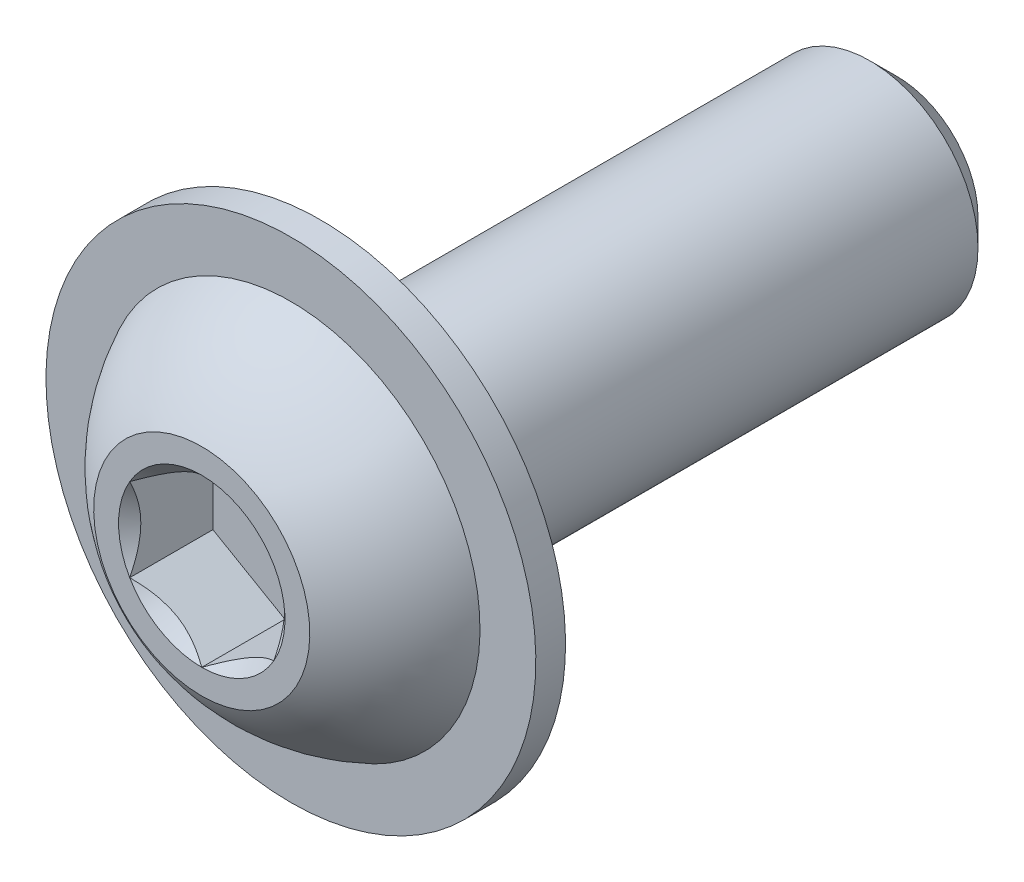
ISO-10303-21;
HEADER;
FILE_DESCRIPTION(('STEP AP214'),'2;1');
FILE_NAME('part.step','',(''),(''),'','','');
FILE_SCHEMA(('AUTOMOTIVE_DESIGN { 1 0 10303 214 1 1 1 1 }'));
ENDSEC;
DATA;
#1=APPLICATION_CONTEXT('core data for automotive mechanical design processes');
#2=APPLICATION_PROTOCOL_DEFINITION('international standard','automotive_design',2000,#1);
#3=PRODUCT_CONTEXT('',#1,'mechanical');
#4=PRODUCT('Part','Part','',(#3));
#5=PRODUCT_RELATED_PRODUCT_CATEGORY('part','',(#4));
#6=PRODUCT_DEFINITION_FORMATION('','',#4);
#7=PRODUCT_DEFINITION_CONTEXT('part definition',#1,'design');
#8=PRODUCT_DEFINITION('design','',#6,#7);
#9=PRODUCT_DEFINITION_SHAPE('','',#8);
#10=(LENGTH_UNIT() NAMED_UNIT(*) SI_UNIT(.MILLI.,.METRE.));
#11=(NAMED_UNIT(*) PLANE_ANGLE_UNIT() SI_UNIT($,.RADIAN.));
#12=(NAMED_UNIT(*) SI_UNIT($,.STERADIAN.) SOLID_ANGLE_UNIT());
#13=UNCERTAINTY_MEASURE_WITH_UNIT(LENGTH_MEASURE(1.E-05),#10,'distance_accuracy_value','');
#14=(GEOMETRIC_REPRESENTATION_CONTEXT(3) GLOBAL_UNCERTAINTY_ASSIGNED_CONTEXT((#13)) GLOBAL_UNIT_ASSIGNED_CONTEXT((#10,
#11,#12)) REPRESENTATION_CONTEXT('',''));
#15=CARTESIAN_POINT('',(0.,0.,0.));
#16=DIRECTION('',(0.,0.,1.));
#17=DIRECTION('',(1.,0.,0.));
#18=AXIS2_PLACEMENT_3D('',#15,#16,#17);
#19=CARTESIAN_POINT('',(0.,3.,-9.65));
#20=DIRECTION('',(0.,0.,1.));
#21=DIRECTION('',(1.,0.,0.));
#22=AXIS2_PLACEMENT_3D('',#19,#20,#21);
#23=PLANE('',#22);
#24=CARTESIAN_POINT('',(0.,0.,-9.65));
#25=DIRECTION('',(0.,0.,1.));
#26=DIRECTION('',(1.,0.,0.));
#27=AXIS2_PLACEMENT_3D('',#24,#25,#26);
#28=CIRCLE('',#27,2.25);
#29=CARTESIAN_POINT('',(2.25,0.,-9.65));
#30=VERTEX_POINT('',#29);
#31=EDGE_CURVE('E57',#30,#30,#28,.F.);
#32=ORIENTED_EDGE('',*,*,#31,.T.);
#33=EDGE_LOOP('',(#32));
#34=FACE_BOUND('',#33,.T.);
#35=ADVANCED_FACE('F42',(#34),#23,.F.);
#36=CARTESIAN_POINT('',(0.,0.,9.65));
#37=DIRECTION('',(0.,0.,1.));
#38=DIRECTION('',(1.,0.,0.));
#39=AXIS2_PLACEMENT_3D('',#36,#37,#38);
#40=CYLINDRICAL_SURFACE('',#39,3.);
#41=CARTESIAN_POINT('',(0.,0.,-8.90000000000001));
#42=DIRECTION('',(0.,0.,1.));
#43=DIRECTION('',(1.,0.,0.));
#44=AXIS2_PLACEMENT_3D('',#41,#42,#43);
#45=CIRCLE('',#44,3.);
#46=CARTESIAN_POINT('',(3.,0.,-8.90000000000001));
#47=VERTEX_POINT('',#46);
#48=EDGE_CURVE('E211',#47,#47,#45,.T.);
#49=ORIENTED_EDGE('',*,*,#48,.T.);
#50=EDGE_LOOP('',(#49));
#51=FACE_BOUND('',#50,.T.);
#52=CARTESIAN_POINT('',(0.,0.,6.35));
#53=DIRECTION('',(0.,0.,1.));
#54=DIRECTION('',(1.,0.,0.));
#55=AXIS2_PLACEMENT_3D('',#52,#53,#54);
#56=CIRCLE('',#55,3.);
#57=CARTESIAN_POINT('',(3.,0.,6.35));
#58=VERTEX_POINT('',#57);
#59=EDGE_CURVE('E207',#58,#58,#56,.T.);
#60=ORIENTED_EDGE('',*,*,#59,.F.);
#61=EDGE_LOOP('',(#60));
#62=FACE_BOUND('',#61,.T.);
#63=ADVANCED_FACE('F222',(#51,#62),#40,.T.);
#64=CARTESIAN_POINT('',(0.,0.,-8.90000000000001));
#65=DIRECTION('',(0.,0.,1.));
#66=DIRECTION('',(1.,0.,0.));
#67=AXIS2_PLACEMENT_3D('',#64,#65,#66);
#68=CONICAL_SURFACE('',#67,3.,0.785398163397451);
#69=CARTESIAN_POINT('',(2.25,0.,-9.65));
#70=CARTESIAN_POINT('',(2.2578125,0.,-9.6421875));
#71=CARTESIAN_POINT('',(2.265625,0.,-9.634375));
#72=CARTESIAN_POINT('',(2.28125,0.,-9.61875));
#73=CARTESIAN_POINT('',(2.2890625,0.,-9.6109375));
#74=CARTESIAN_POINT('',(2.3046875,0.,-9.5953125));
#75=CARTESIAN_POINT('',(2.3125,0.,-9.5875));
#76=CARTESIAN_POINT('',(2.328125,0.,-9.571875));
#77=CARTESIAN_POINT('',(2.3359375,0.,-9.5640625));
#78=CARTESIAN_POINT('',(2.3515625,0.,-9.5484375));
#79=CARTESIAN_POINT('',(2.359375,0.,-9.540625));
#80=CARTESIAN_POINT('',(2.375,0.,-9.525));
#81=CARTESIAN_POINT('',(2.3828125,0.,-9.5171875));
#82=CARTESIAN_POINT('',(2.3984375,0.,-9.5015625));
#83=CARTESIAN_POINT('',(2.40625,0.,-9.49375));
#84=CARTESIAN_POINT('',(2.421875,0.,-9.478125));
#85=CARTESIAN_POINT('',(2.4296875,0.,-9.4703125));
#86=CARTESIAN_POINT('',(2.4453125,0.,-9.4546875));
#87=CARTESIAN_POINT('',(2.453125,0.,-9.446875));
#88=CARTESIAN_POINT('',(2.46875,0.,-9.43125));
#89=CARTESIAN_POINT('',(2.4765625,0.,-9.4234375));
#90=CARTESIAN_POINT('',(2.4921875,0.,-9.4078125));
#91=CARTESIAN_POINT('',(2.5,0.,-9.4));
#92=CARTESIAN_POINT('',(2.515625,0.,-9.384375));
#93=CARTESIAN_POINT('',(2.5234375,0.,-9.3765625));
#94=CARTESIAN_POINT('',(2.5390625,0.,-9.3609375));
#95=CARTESIAN_POINT('',(2.546875,0.,-9.353125));
#96=CARTESIAN_POINT('',(2.5625,0.,-9.3375));
#97=CARTESIAN_POINT('',(2.5703125,0.,-9.3296875));
#98=CARTESIAN_POINT('',(2.5859375,0.,-9.3140625));
#99=CARTESIAN_POINT('',(2.59375,0.,-9.30625));
#100=CARTESIAN_POINT('',(2.609375,0.,-9.290625));
#101=CARTESIAN_POINT('',(2.6171875,0.,-9.2828125));
#102=CARTESIAN_POINT('',(2.6328125,0.,-9.2671875));
#103=CARTESIAN_POINT('',(2.640625,0.,-9.259375));
#104=CARTESIAN_POINT('',(2.65625,0.,-9.24375));
#105=CARTESIAN_POINT('',(2.6640625,0.,-9.2359375));
#106=CARTESIAN_POINT('',(2.6796875,0.,-9.2203125));
#107=CARTESIAN_POINT('',(2.6875,0.,-9.2125));
#108=CARTESIAN_POINT('',(2.703125,0.,-9.196875));
#109=CARTESIAN_POINT('',(2.7109375,0.,-9.1890625));
#110=CARTESIAN_POINT('',(2.7265625,0.,-9.1734375));
#111=CARTESIAN_POINT('',(2.734375,0.,-9.165625));
#112=CARTESIAN_POINT('',(2.75,0.,-9.15));
#113=CARTESIAN_POINT('',(2.7578125,0.,-9.1421875));
#114=CARTESIAN_POINT('',(2.7734375,0.,-9.1265625));
#115=CARTESIAN_POINT('',(2.78125,0.,-9.11875));
#116=CARTESIAN_POINT('',(2.796875,0.,-9.103125));
#117=CARTESIAN_POINT('',(2.8046875,0.,-9.0953125));
#118=CARTESIAN_POINT('',(2.8203125,0.,-9.0796875));
#119=CARTESIAN_POINT('',(2.828125,0.,-9.071875));
#120=CARTESIAN_POINT('',(2.84375,0.,-9.05625000000001));
#121=CARTESIAN_POINT('',(2.8515625,0.,-9.0484375));
#122=CARTESIAN_POINT('',(2.8671875,0.,-9.0328125));
#123=CARTESIAN_POINT('',(2.875,0.,-9.02500000000001));
#124=CARTESIAN_POINT('',(2.890625,0.,-9.00937500000001));
#125=CARTESIAN_POINT('',(2.8984375,0.,-9.0015625));
#126=CARTESIAN_POINT('',(2.9140625,0.,-8.98593750000001));
#127=CARTESIAN_POINT('',(2.921875,0.,-8.97812500000001));
#128=CARTESIAN_POINT('',(2.9375,0.,-8.96250000000001));
#129=CARTESIAN_POINT('',(2.9453125,0.,-8.95468750000001));
#130=CARTESIAN_POINT('',(2.9609375,0.,-8.93906250000001));
#131=CARTESIAN_POINT('',(2.96875,0.,-8.93125000000001));
#132=CARTESIAN_POINT('',(2.984375,0.,-8.91562500000001));
#133=CARTESIAN_POINT('',(2.9921875,0.,-8.90781250000001));
#134=CARTESIAN_POINT('',(3.,0.,-8.90000000000001));
#135=B_SPLINE_CURVE_WITH_KNOTS('',3,(#69,#70,#71,#72,#73,#74,#75,#76,#77,#78,#79,#80,#81,#82,
#83,#84,#85,#86,#87,#88,#89,#90,#91,#92,#93,#94,#95,#96,#97,#98,#99,#100,#101,#102,#103,#104,
#105,#106,#107,#108,#109,#110,#111,#112,#113,#114,#115,#116,#117,#118,#119,#120,#121,#122,#123,
#124,#125,#126,#127,#128,#129,#130,#131,#132,#133,#134),.UNSPECIFIED.,.F.,.F.,(4,2,2,2,2,2,2,2,
2,2,2,2,2,2,2,2,2,2,2,2,2,2,2,2,2,2,2,2,2,2,2,2,4),(0.,0.0331456303681201,0.0662912607362389,
0.099436891104359,0.132582521472478,0.165728151840596,0.198873782208716,0.232019412576835,
0.265165042944954,0.298310673313074,0.331456303681193,0.364601934049313,0.397747564417432,
0.430893194785551,0.464038825153671,0.497184455521789,0.530330085889908,0.563475716258028,
0.596621346626147,0.629766976994267,0.662912607362386,0.696058237730504,0.729203868098624,
0.762349498466743,0.795495128834863,0.828640759202982,0.861786389571101,0.894932019939221,
0.92807765030734,0.961223280675459,0.994368911043578,1.0275145414117,1.06066017177982),.UNSPECIFIED.);
#136=EDGE_CURVE('BSEAM44',#30,#47,#135,.T.);
#137=ORIENTED_EDGE('',*,*,#31,.F.);
#138=ORIENTED_EDGE('',*,*,#48,.F.);
#139=ORIENTED_EDGE('',*,*,#136,.T.);
#140=ORIENTED_EDGE('',*,*,#136,.F.);
#141=EDGE_LOOP('',(#137,#139,#138,#140));
#142=FACE_BOUND('',#141,.T.);
#143=ADVANCED_FACE('F44',(#142),#68,.T.);
#144=CARTESIAN_POINT('',(0.,-6.8,6.35));
#145=DIRECTION('',(0.,0.,1.));
#146=DIRECTION('',(0.,-1.,0.));
#147=AXIS2_PLACEMENT_3D('',#144,#145,#146);
#148=PLANE('',#147);
#149=CARTESIAN_POINT('',(0.,0.,6.35));
#150=DIRECTION('',(0.,0.,1.));
#151=DIRECTION('',(0.,-1.,0.));
#152=AXIS2_PLACEMENT_3D('',#149,#150,#151);
#153=CIRCLE('',#152,6.8);
#154=CARTESIAN_POINT('',(0.,-6.8,6.35));
#155=VERTEX_POINT('',#154);
#156=EDGE_CURVE('E199',#155,#155,#153,.T.);
#157=ORIENTED_EDGE('',*,*,#156,.F.);
#158=EDGE_LOOP('',(#157));
#159=FACE_BOUND('',#158,.T.);
#160=ORIENTED_EDGE('',*,*,#59,.T.);
#161=EDGE_LOOP('',(#160));
#162=FACE_BOUND('',#161,.T.);
#163=ADVANCED_FACE('F221',(#159,#162),#148,.F.);
#164=CARTESIAN_POINT('',(0.,0.,4.6625));
#165=DIRECTION('',(0.,0.,1.));
#166=DIRECTION('',(0.,-1.,0.));
#167=AXIS2_PLACEMENT_3D('',#164,#165,#166);
#168=SPHERICAL_SURFACE('',#167,5.82023678642029);
#169=CARTESIAN_POINT('',(0.,0.,9.65));
#170=DIRECTION('',(0.,0.,1.));
#171=DIRECTION('',(0.,-1.,0.));
#172=AXIS2_PLACEMENT_3D('',#169,#170,#171);
#173=CIRCLE('',#172,3.);
#174=CARTESIAN_POINT('',(0.,-3.,9.65));
#175=VERTEX_POINT('',#174);
#176=EDGE_CURVE('E203',#175,#175,#173,.T.);
#177=CARTESIAN_POINT('',(0.,0.,7.175));
#178=DIRECTION('',(0.,0.,1.));
#179=DIRECTION('',(0.,-1.,0.));
#180=AXIS2_PLACEMENT_3D('',#177,#178,#179);
#181=CIRCLE('',#180,5.25);
#182=CARTESIAN_POINT('',(0.,-5.25,7.175));
#183=VERTEX_POINT('',#182);
#184=EDGE_CURVE('E191',#183,#183,#181,.T.);
#185=CARTESIAN_POINT('',(0.,-3.,9.65));
#186=CARTESIAN_POINT('',(0.,-3.03028420289884,9.63178398285952));
#187=CARTESIAN_POINT('',(0.,-3.0604024537021,9.6132920727079));
#188=CARTESIAN_POINT('',(0.,-3.12029714687073,9.57576274503713));
#189=CARTESIAN_POINT('',(0.,-3.1500735892361,9.556725327518));
#190=CARTESIAN_POINT('',(0.,-3.20927476128223,9.518111263767));
#191=CARTESIAN_POINT('',(0.,-3.23869949096298,9.49853461753513));
#192=CARTESIAN_POINT('',(0.,-3.29718748048685,9.45884860243864));
#193=CARTESIAN_POINT('',(0.,-3.32625074032996,9.43873923357403));
#194=CARTESIAN_POINT('',(0.,-3.38400614482375,9.39799444306176));
#195=CARTESIAN_POINT('',(0.,-3.41269828947443,9.3773590214141));
#196=CARTESIAN_POINT('',(0.,-3.46970194355215,9.33556897322005));
#197=CARTESIAN_POINT('',(0.,-3.4980134529792,9.31441434667365));
#198=CARTESIAN_POINT('',(0.,-3.55424644229442,9.27159290791346));
#199=CARTESIAN_POINT('',(0.,-3.5821679221826,9.24992609569967));
#200=CARTESIAN_POINT('',(0.,-3.63761158767924,9.2060874750371));
#201=CARTESIAN_POINT('',(0.,-3.66513377328771,9.18391566658832));
#202=CARTESIAN_POINT('',(0.,-3.7197697179341,9.13907441038664));
#203=CARTESIAN_POINT('',(0.,-3.74688347697201,9.11640496263375));
#204=CARTESIAN_POINT('',(0.,-3.80069357171985,9.07057594989702));
#205=CARTESIAN_POINT('',(0.,-3.82738990742978,9.04741638491319));
#206=CARTESIAN_POINT('',(0.,-3.88035629726865,9.00061482241131));
#207=CARTESIAN_POINT('',(0.,-3.90662635139759,8.97697282489327));
#208=CARTESIAN_POINT('',(0.,-3.95873146126904,8.92921424209951));
#209=CARTESIAN_POINT('',(0.,-3.98456651701155,8.90509765682379));
#210=CARTESIAN_POINT('',(0.,-4.03579305764359,8.85639790076632));
#211=CARTESIAN_POINT('',(0.,-4.06118454253313,8.83181472998457));
#212=CARTESIAN_POINT('',(0.,-4.11151551617632,8.782189959987));
#213=CARTESIAN_POINT('',(0.,-4.13645500492997,8.75714836077117));
#214=CARTESIAN_POINT('',(0.,-4.18587371099773,8.70661504309093));
#215=CARTESIAN_POINT('',(0.,-4.21035292831183,8.68112332462652));
#216=CARTESIAN_POINT('',(0.,-4.25884296892189,8.62969822699104));
#217=CARTESIAN_POINT('',(0.,-4.28285379221785,8.60376484781998));
#218=CARTESIAN_POINT('',(0.,-4.33039907763335,8.55146503386293));
#219=CARTESIAN_POINT('',(0.,-4.35393353975289,8.52509859907694));
#220=CARTESIAN_POINT('',(0.,-4.40051829372119,8.47194142267622));
#221=CARTESIAN_POINT('',(0.,-4.42356858556995,8.4451506810615));
#222=CARTESIAN_POINT('',(0.,-4.46917735055741,8.39115378058099));
#223=CARTESIAN_POINT('',(0.,-4.49173582369612,8.36394762171521));
#224=CARTESIAN_POINT('',(0.,-4.5363534660172,8.30912891415208));
#225=CARTESIAN_POINT('',(0.,-4.55841263519958,8.28151636545474));
#226=CARTESIAN_POINT('',(0.,-4.60202435003835,8.2258940404943));
#227=CARTESIAN_POINT('',(0.,-4.62357689569476,8.19788426423121));
#228=CARTESIAN_POINT('',(0.,-4.66616821201751,8.14147677821136));
#229=CARTESIAN_POINT('',(0.,-4.68720698268385,8.11307906845459));
#230=CARTESIAN_POINT('',(0.,-4.72876376804039,8.05590513824151));
#231=CARTESIAN_POINT('',(0.,-4.7492817827306,8.0271289177852));
#232=CARTESIAN_POINT('',(0.,-4.78979024794497,7.9692075145635));
#233=CARTESIAN_POINT('',(0.,-4.80978069846913,7.94006233179811));
#234=CARTESIAN_POINT('',(0.,-4.84922740221028,7.88141267477349));
#235=CARTESIAN_POINT('',(0.,-4.86868365542727,7.85190820051427));
#236=CARTESIAN_POINT('',(0.,-4.90705550868671,7.79254975054515));
#237=CARTESIAN_POINT('',(0.,-4.92597110872916,7.76269577483525));
#238=CARTESIAN_POINT('',(0.,-4.96325537909849,7.70264822794243));
#239=CARTESIAN_POINT('',(0.,-4.98162404942537,7.67245465675951));
#240=CARTESIAN_POINT('',(0.,-5.01780836556591,7.61173793771347));
#241=CARTESIAN_POINT('',(0.,-5.03562401137957,7.58121478985035));
#242=CARTESIAN_POINT('',(0.,-5.07069636621364,7.51984904510197));
#243=CARTESIAN_POINT('',(0.,-5.08795307523405,7.48900644821672));
#244=CARTESIAN_POINT('',(0.,-5.12190183333915,7.42701204092135));
#245=CARTESIAN_POINT('',(0.,-5.13859388242383,7.39586023051123));
#246=CARTESIAN_POINT('',(0.,-5.17140777116705,7.33325772739395));
#247=CARTESIAN_POINT('',(0.,-5.18752961082559,7.30180703468679));
#248=CARTESIAN_POINT('',(0.,-5.21919777159946,7.23861722302079));
#249=CARTESIAN_POINT('',(0.,-5.2347440927148,7.20687810406196));
#250=CARTESIAN_POINT('',(0.,-5.25,7.175));
#251=B_SPLINE_CURVE_WITH_KNOTS('',3,(#185,#186,#187,#188,#189,#190,#191,#192,#193,#194,#195,
#196,#197,#198,#199,#200,#201,#202,#203,#204,#205,#206,#207,#208,#209,#210,#211,#212,#213,#214,
#215,#216,#217,#218,#219,#220,#221,#222,#223,#224,#225,#226,#227,#228,#229,#230,#231,#232,#233,
#234,#235,#236,#237,#238,#239,#240,#241,#242,#243,#244,#245,#246,#247,#248,#249,#250),
.UNSPECIFIED.,.F.,.F.,(4,2,2,2,2,2,2,2,2,2,2,2,2,2,2,2,2,2,2,2,2,2,2,2,2,2,2,2,2,2,2,2,4),(0.,
0.106020256452207,0.212040512904415,0.318060769356622,0.424081025808829,0.530101282261036,
0.636121538713244,0.742141795165449,0.848162051617657,0.954182308069865,1.06020256452207,
1.16622282097428,1.27224307742649,1.37826333387869,1.4842835903309,1.59030384678311,
1.69632410323532,1.80234435968752,1.90836461613973,2.01438487259194,2.12040512904414,
2.22642538549635,2.33244564194856,2.43846589840076,2.54448615485297,2.65050641130518,
2.75652666775739,2.86254692420959,2.9685671806618,3.07458743711401,3.18060769356621,
3.28662795001842,3.39264820647063),.UNSPECIFIED.);
#252=EDGE_CURVE('BSEAM231',#175,#183,#251,.T.);
#253=ORIENTED_EDGE('',*,*,#176,.F.);
#254=ORIENTED_EDGE('',*,*,#184,.T.);
#255=ORIENTED_EDGE('',*,*,#252,.T.);
#256=ORIENTED_EDGE('',*,*,#252,.F.);
#257=EDGE_LOOP('',(#253,#255,#254,#256));
#258=FACE_BOUND('',#257,.T.);
#259=ADVANCED_FACE('F231',(#258),#168,.T.);
#260=CARTESIAN_POINT('',(0.,-3.,9.65));
#261=DIRECTION('',(0.,0.,-1.));
#262=DIRECTION('',(0.,1.,0.));
#263=AXIS2_PLACEMENT_3D('',#260,#261,#262);
#264=PLANE('',#263);
#265=CARTESIAN_POINT('',(0.,0.,9.65));
#266=DIRECTION('',(0.,0.,1.));
#267=DIRECTION('',(1.,0.,0.));
#268=AXIS2_PLACEMENT_3D('',#265,#266,#267);
#269=CIRCLE('',#268,2.3094010767585);
#270=CARTESIAN_POINT('',(0.,2.3094010767585,9.65));
#271=VERTEX_POINT('',#270);
#272=CARTESIAN_POINT('',(-2.,1.15470053837925,9.65));
#273=VERTEX_POINT('',#272);
#274=EDGE_CURVE('E148',#271,#273,#269,.T.);
#275=ORIENTED_EDGE('',*,*,#274,.F.);
#276=CARTESIAN_POINT('',(2.,1.15470053837925,9.65));
#277=VERTEX_POINT('',#276);
#278=EDGE_CURVE('E143',#277,#271,#269,.T.);
#279=ORIENTED_EDGE('',*,*,#278,.F.);
#280=CARTESIAN_POINT('',(2.,-1.15470053837925,9.65));
#281=VERTEX_POINT('',#280);
#282=EDGE_CURVE('E111',#281,#277,#269,.T.);
#283=ORIENTED_EDGE('',*,*,#282,.F.);
#284=CARTESIAN_POINT('',(0.,-2.30940107675851,9.65));
#285=VERTEX_POINT('',#284);
#286=EDGE_CURVE('E102',#285,#281,#269,.T.);
#287=ORIENTED_EDGE('',*,*,#286,.F.);
#288=CARTESIAN_POINT('',(-2.,-1.15470053837925,9.65));
#289=VERTEX_POINT('',#288);
#290=EDGE_CURVE('E63',#289,#285,#269,.T.);
#291=ORIENTED_EDGE('',*,*,#290,.F.);
#292=EDGE_CURVE('E70',#273,#289,#269,.T.);
#293=ORIENTED_EDGE('',*,*,#292,.F.);
#294=EDGE_LOOP('',(#275,#279,#283,#287,#291,#293));
#295=FACE_BOUND('',#294,.T.);
#296=ORIENTED_EDGE('',*,*,#176,.T.);
#297=EDGE_LOOP('',(#296));
#298=FACE_BOUND('',#297,.T.);
#299=ADVANCED_FACE('F140',(#295,#298),#264,.F.);
#300=CARTESIAN_POINT('',(0.,0.,9.65));
#301=DIRECTION('',(0.,0.,1.));
#302=DIRECTION('',(0.,-1.,0.));
#303=AXIS2_PLACEMENT_3D('',#300,#301,#302);
#304=CYLINDRICAL_SURFACE('',#303,6.8);
#305=CARTESIAN_POINT('',(0.,0.,7.175));
#306=DIRECTION('',(0.,0.,1.));
#307=DIRECTION('',(0.,-1.,0.));
#308=AXIS2_PLACEMENT_3D('',#305,#306,#307);
#309=CIRCLE('',#308,6.8);
#310=CARTESIAN_POINT('',(0.,-6.8,7.175));
#311=VERTEX_POINT('',#310);
#312=EDGE_CURVE('E195',#311,#311,#309,.T.);
#313=ORIENTED_EDGE('',*,*,#312,.F.);
#314=EDGE_LOOP('',(#313));
#315=FACE_BOUND('',#314,.T.);
#316=ORIENTED_EDGE('',*,*,#156,.T.);
#317=EDGE_LOOP('',(#316));
#318=FACE_BOUND('',#317,.T.);
#319=ADVANCED_FACE('F246',(#315,#318),#304,.T.);
#320=CARTESIAN_POINT('',(0.,-5.25,7.175));
#321=DIRECTION('',(0.,0.,-1.));
#322=DIRECTION('',(0.,1.,0.));
#323=AXIS2_PLACEMENT_3D('',#320,#321,#322);
#324=PLANE('',#323);
#325=ORIENTED_EDGE('',*,*,#184,.F.);
#326=EDGE_LOOP('',(#325));
#327=FACE_BOUND('',#326,.T.);
#328=ORIENTED_EDGE('',*,*,#312,.T.);
#329=EDGE_LOOP('',(#328));
#330=FACE_BOUND('',#329,.T.);
#331=ADVANCED_FACE('F250',(#327,#330),#324,.F.);
#332=CARTESIAN_POINT('',(0.,0.,9.65));
#333=DIRECTION('',(0.,0.,1.));
#334=DIRECTION('',(1.,0.,0.));
#335=AXIS2_PLACEMENT_3D('',#332,#333,#334);
#336=CONICAL_SURFACE('',#335,2.3094010767585,0.78539816339745);
#337=ORIENTED_EDGE('',*,*,#282,.T.);
#338=CARTESIAN_POINT('',(2.,-2.30294417292924,10.3907713550277));
#339=CARTESIAN_POINT('',(2.,-2.24687002663712,10.348443273626));
#340=CARTESIAN_POINT('',(2.,-2.19048190536959,10.3065251568643));
#341=CARTESIAN_POINT('',(2.,-2.07695390496424,10.223690417861));
#342=CARTESIAN_POINT('',(2.,-2.01981384066454,10.1827740496681));
#343=CARTESIAN_POINT('',(2.,-1.90424016804776,10.1018334520186));
#344=CARTESIAN_POINT('',(2.,-1.8457999674391,10.0618185915599));
#345=CARTESIAN_POINT('',(2.,-1.7279274546176,9.9832889936643));
#346=CARTESIAN_POINT('',(2.,-1.66849521292324,9.94477415024314));
#347=CARTESIAN_POINT('',(2.,-1.4816299571002,9.82764065160429));
#348=CARTESIAN_POINT('',(2.,-1.35220318163536,9.75214590172964));
#349=CARTESIAN_POINT('',(2.,-1.08689521592924,9.61404935099438));
#350=CARTESIAN_POINT('',(2.,-0.951037763938192,9.5514040859035));
#351=CARTESIAN_POINT('',(2.,-0.747111912259409,9.47476354387514));
#352=CARTESIAN_POINT('',(2.,-0.682064034147876,9.45276717991912));
#353=CARTESIAN_POINT('',(2.,-0.550398103294752,9.41399668766014));
#354=CARTESIAN_POINT('',(2.,-0.483779942722476,9.39722291912118));
#355=CARTESIAN_POINT('',(2.,-0.350484328847654,9.37004825788445));
#356=CARTESIAN_POINT('',(2.,-0.283829489364785,9.35953817674169));
#357=CARTESIAN_POINT('',(2.,-0.149806987139377,9.34509608554491));
#358=CARTESIAN_POINT('',(2.,-0.0824394489341221,9.34116294473312));
#359=CARTESIAN_POINT('',(2.,0.0499055622944893,9.34016647693372));
#360=CARTESIAN_POINT('',(2.,0.114881285143172,9.34285964485041));
#361=CARTESIAN_POINT('',(2.,0.24427592148276,9.35443007042269));
#362=CARTESIAN_POINT('',(2.,0.308694780266753,9.36330792883322));
#363=CARTESIAN_POINT('',(2.,0.437599788610704,9.38691365929615));
#364=CARTESIAN_POINT('',(2.,0.502067428644594,9.40174108344651));
#365=CARTESIAN_POINT('',(2.,0.629594322598306,9.43645788362797));
#366=CARTESIAN_POINT('',(2.,0.69265369388315,9.45634683610628));
#367=CARTESIAN_POINT('',(2.,0.891187889210544,9.5264469792562));
#368=CARTESIAN_POINT('',(2.,1.02383545707306,9.58464180032151));
#369=CARTESIAN_POINT('',(2.,1.28290932150074,9.71403057545958));
#370=CARTESIAN_POINT('',(2.,1.4093111258757,9.78527123141484));
#371=CARTESIAN_POINT('',(2.,1.59200441438963,9.89644199187472));
#372=CARTESIAN_POINT('',(2.,1.65027549026191,9.93318219033738));
#373=CARTESIAN_POINT('',(2.,1.76581760389243,10.0082145141838));
#374=CARTESIAN_POINT('',(2.,1.82308856543105,10.046506757118));
#375=CARTESIAN_POINT('',(2.,1.93629654762084,10.1240422640812));
#376=CARTESIAN_POINT('',(2.,1.99224062500539,10.1632752761336));
#377=CARTESIAN_POINT('',(2.,2.103364240299,10.2427788307365));
#378=CARTESIAN_POINT('',(2.,2.15854398422468,10.2830490850006));
#379=CARTESIAN_POINT('',(2.,2.21340370692658,10.3237442381459));
#380=B_SPLINE_CURVE_WITH_KNOTS('',3,(#338,#339,#340,#341,#342,#343,#344,#345,#346,#347,#348,
#349,#350,#351,#352,#353,#354,#355,#356,#357,#358,#359,#360,#361,#362,#363,#364,#365,#366,#367,
#368,#369,#370,#371,#372,#373,#374,#375,#376,#377,#378,#379),.UNSPECIFIED.,.F.,.F.,(4,2,2,2,2,2,
2,2,2,2,2,2,2,2,2,2,2,2,2,2,4),(0.,0.210772731976892,0.421598374658591,0.634057554623489,
0.846501695870172,1.29562155455624,1.74319622821645,1.94902062110208,2.15485918928326,
2.35699582502636,2.5590977043214,2.75388435553556,2.94868993014815,3.14690093452586,
3.34509535789702,3.77838155837654,4.21325029921625,4.41989056685647,4.62654651460921,
4.8315237711129,5.03644465914085),.UNSPECIFIED.);
#381=EDGE_CURVE('E11',#281,#277,#380,.T.);
#382=ORIENTED_EDGE('',*,*,#381,.F.);
#383=EDGE_LOOP('',(#337,#382));
#384=FACE_BOUND('',#383,.T.);
#385=ADVANCED_FACE('F115',(#384),#336,.F.);
#386=ORIENTED_EDGE('',*,*,#278,.T.);
#387=CARTESIAN_POINT('',(2.0002,1.15458506832541,9.65011547871366));
#388=CARTESIAN_POINT('',(1.9314469659693,1.19427965103064,9.61045309022559));
#389=CARTESIAN_POINT('',(1.86154425786449,1.23463799837204,9.57311998228416));
#390=CARTESIAN_POINT('',(1.71900475544956,1.31693321846145,9.50476368513614));
#391=CARTESIAN_POINT('',(1.64635440243464,1.35887791933134,9.47377853373722));
#392=CARTESIAN_POINT('',(1.49985839894603,1.44345742638069,9.42070021654414));
#393=CARTESIAN_POINT('',(1.42605006475371,1.48607068799507,9.39847362717661));
#394=CARTESIAN_POINT('',(1.27680836816474,1.57223542169502,9.36422881667508));
#395=CARTESIAN_POINT('',(1.20137956608185,1.61578426088223,9.35218502914414));
#396=CARTESIAN_POINT('',(1.07138449932892,1.69083694766536,9.34131851190557));
#397=CARTESIAN_POINT('',(1.01698621602989,1.72224381117151,9.33970975360997));
#398=CARTESIAN_POINT('',(0.908278544480309,1.78500621460364,9.34241887759871));
#399=CARTESIAN_POINT('',(0.853969194078663,1.81636173267754,9.34673883775798));
#400=CARTESIAN_POINT('',(0.745863272410664,1.87877671565355,9.3610595674099));
#401=CARTESIAN_POINT('',(0.69206734344521,1.90983580972306,9.37106669276201));
#402=CARTESIAN_POINT('',(0.585405737694428,1.97141691651547,9.39621243024966));
#403=CARTESIAN_POINT('',(0.532539989929289,2.00193897021859,9.41135064904224));
#404=CARTESIAN_POINT('',(0.397120266910158,2.08012358375727,9.45629450342919));
#405=CARTESIAN_POINT('',(0.315406165150523,2.12730124240478,9.48948883942582));
#406=CARTESIAN_POINT('',(0.195252962742198,2.19667172615922,9.54552582317137));
#407=CARTESIAN_POINT('',(0.155657147890823,2.21953238052245,9.56521470294694));
#408=CARTESIAN_POINT('',(0.0771990411121273,2.26483018959124,9.60638731836487));
#409=CARTESIAN_POINT('',(0.0383363164062591,2.28726759416161,9.62786995165125));
#410=CARTESIAN_POINT('',(-0.000200000000000282,2.30951654681234,9.65011547871366));
#411=B_SPLINE_CURVE_WITH_KNOTS('',3,(#387,#388,#389,#390,#391,#392,#393,#394,#395,#396,#397,
#398,#399,#400,#401,#402,#403,#404,#405,#406,#407,#408,#409,#410),.UNSPECIFIED.,.F.,.F.,(4,2,2,
2,2,2,2,2,2,2,2,4),(0.,0.266420613771064,0.534393751523388,0.798110374376913,1.06116288956936,
1.24939906803722,1.43770123566247,1.62621426093931,1.81471283831913,2.11415604834145,
2.26347170717791,2.41269626969771),.UNSPECIFIED.);
#412=EDGE_CURVE('E147',#277,#271,#411,.T.);
#413=ORIENTED_EDGE('',*,*,#412,.F.);
#414=EDGE_LOOP('',(#386,#413));
#415=FACE_BOUND('',#414,.T.);
#416=ADVANCED_FACE('F340',(#415),#336,.F.);
#417=ORIENTED_EDGE('',*,*,#274,.T.);
#418=CARTESIAN_POINT('',(0.000199999999999668,2.30951654681234,9.65011547871366));
#419=CARTESIAN_POINT('',(-0.068553034030706,2.26982196410711,9.61045309022559));
#420=CARTESIAN_POINT('',(-0.138455742135512,2.22946361676572,9.57311998228416));
#421=CARTESIAN_POINT('',(-0.280995244550437,2.1471683966763,9.50476368513614));
#422=CARTESIAN_POINT('',(-0.353645597565358,2.10522369580642,9.47377853373722));
#423=CARTESIAN_POINT('',(-0.500141601053971,2.02064418875706,9.42070021654414));
#424=CARTESIAN_POINT('',(-0.573949935246294,1.97803092714269,9.39847362717661));
#425=CARTESIAN_POINT('',(-0.723191631835264,1.89186619344273,9.36422881667508));
#426=CARTESIAN_POINT('',(-0.798620433918151,1.84831735425552,9.35218502914414));
#427=CARTESIAN_POINT('',(-0.928615500671079,1.7732646674724,9.34131851190557));
#428=CARTESIAN_POINT('',(-0.983013783970109,1.74185780396625,9.33970975360997));
#429=CARTESIAN_POINT('',(-1.09172145551969,1.67909540053412,9.34241887759871));
#430=CARTESIAN_POINT('',(-1.14603080592134,1.64773988246021,9.34673883775798));
#431=CARTESIAN_POINT('',(-1.25413672758934,1.5853248994842,9.3610595674099));
#432=CARTESIAN_POINT('',(-1.30793265655479,1.55426580541469,9.37106669276201));
#433=CARTESIAN_POINT('',(-1.41459426230557,1.49268469862228,9.39621243024966));
#434=CARTESIAN_POINT('',(-1.46746001007071,1.46216264491917,9.41135064904224));
#435=CARTESIAN_POINT('',(-1.60287973308984,1.38397803138049,9.45629450342919));
#436=CARTESIAN_POINT('',(-1.68459383484948,1.33680037273297,9.48948883942582));
#437=CARTESIAN_POINT('',(-1.8047470372578,1.26742988897853,9.54552582317137));
#438=CARTESIAN_POINT('',(-1.84434285210918,1.24456923461531,9.56521470294694));
#439=CARTESIAN_POINT('',(-1.92280095888787,1.19927142554652,9.60638731836487));
#440=CARTESIAN_POINT('',(-1.96166368359374,1.17683402097614,9.62786995165125));
#441=CARTESIAN_POINT('',(-2.0002,1.15458506832541,9.65011547871366));
#442=B_SPLINE_CURVE_WITH_KNOTS('',3,(#418,#419,#420,#421,#422,#423,#424,#425,#426,#427,#428,
#429,#430,#431,#432,#433,#434,#435,#436,#437,#438,#439,#440,#441),.UNSPECIFIED.,.F.,.F.,(4,2,2,
2,2,2,2,2,2,2,2,4),(0.,0.266420613771064,0.534393751523388,0.798110374376914,1.06116288956936,
1.24939906803722,1.43770123566247,1.62621426093932,1.81471283831913,2.11415604834145,
2.26347170717791,2.41269626969771),.UNSPECIFIED.);
#443=EDGE_CURVE('E153',#271,#273,#442,.T.);
#444=ORIENTED_EDGE('',*,*,#443,.F.);
#445=EDGE_LOOP('',(#417,#444));
#446=FACE_BOUND('',#445,.T.);
#447=ADVANCED_FACE('F158',(#446),#336,.F.);
#448=ORIENTED_EDGE('',*,*,#292,.T.);
#449=CARTESIAN_POINT('',(-2.,-2.30294417292923,10.3907713550277));
#450=CARTESIAN_POINT('',(-2.,-2.24687002663712,10.348443273626));
#451=CARTESIAN_POINT('',(-2.,-2.19048190536959,10.3065251568643));
#452=CARTESIAN_POINT('',(-2.,-2.07695390496424,10.223690417861));
#453=CARTESIAN_POINT('',(-2.,-2.01981384066454,10.1827740496681));
#454=CARTESIAN_POINT('',(-2.,-1.90424016804776,10.1018334520186));
#455=CARTESIAN_POINT('',(-2.,-1.8457999674391,10.0618185915599));
#456=CARTESIAN_POINT('',(-2.,-1.7279274546176,9.9832889936643));
#457=CARTESIAN_POINT('',(-2.,-1.66849521292324,9.94477415024314));
#458=CARTESIAN_POINT('',(-2.,-1.4816299571002,9.82764065160429));
#459=CARTESIAN_POINT('',(-2.,-1.35220318163536,9.75214590172964));
#460=CARTESIAN_POINT('',(-2.,-1.08689521592925,9.61404935099438));
#461=CARTESIAN_POINT('',(-2.,-0.951037763938194,9.5514040859035));
#462=CARTESIAN_POINT('',(-2.,-0.747111912259411,9.47476354387514));
#463=CARTESIAN_POINT('',(-2.,-0.682064034147877,9.45276717991912));
#464=CARTESIAN_POINT('',(-2.,-0.550398103294754,9.41399668766014));
#465=CARTESIAN_POINT('',(-2.,-0.483779942722477,9.39722291912118));
#466=CARTESIAN_POINT('',(-2.,-0.350484328847656,9.37004825788445));
#467=CARTESIAN_POINT('',(-2.,-0.283829489364787,9.35953817674169));
#468=CARTESIAN_POINT('',(-2.,-0.149806987139378,9.34509608554492));
#469=CARTESIAN_POINT('',(-2.,-0.0824394489341238,9.34116294473312));
#470=CARTESIAN_POINT('',(-2.,0.0499055622944877,9.34016647693372));
#471=CARTESIAN_POINT('',(-2.,0.11488128514317,9.34285964485041));
#472=CARTESIAN_POINT('',(-2.,0.244275921482759,9.35443007042269));
#473=CARTESIAN_POINT('',(-2.,0.308694780266751,9.36330792883322));
#474=CARTESIAN_POINT('',(-2.,0.437599788610703,9.38691365929615));
#475=CARTESIAN_POINT('',(-2.,0.502067428644593,9.40174108344651));
#476=CARTESIAN_POINT('',(-2.,0.629594322598304,9.43645788362797));
#477=CARTESIAN_POINT('',(-2.,0.692653693883149,9.45634683610628));
#478=CARTESIAN_POINT('',(-2.,0.891187889210542,9.5264469792562));
#479=CARTESIAN_POINT('',(-2.,1.02383545707306,9.58464180032151));
#480=CARTESIAN_POINT('',(-2.,1.28290932150074,9.71403057545957));
#481=CARTESIAN_POINT('',(-2.,1.4093111258757,9.78527123141484));
#482=CARTESIAN_POINT('',(-2.,1.59200441438963,9.89644199187472));
#483=CARTESIAN_POINT('',(-2.,1.6502754902619,9.93318219033737));
#484=CARTESIAN_POINT('',(-2.,1.76581760389242,10.0082145141838));
#485=CARTESIAN_POINT('',(-2.,1.82308856543104,10.046506757118));
#486=CARTESIAN_POINT('',(-2.,1.93629654762084,10.1240422640812));
#487=CARTESIAN_POINT('',(-2.,1.99224062500538,10.1632752761336));
#488=CARTESIAN_POINT('',(-2.,2.10336424029899,10.2427788307365));
#489=CARTESIAN_POINT('',(-2.,2.15854398422468,10.2830490850006));
#490=CARTESIAN_POINT('',(-2.,2.21340370692658,10.3237442381459));
#491=B_SPLINE_CURVE_WITH_KNOTS('',3,(#449,#450,#451,#452,#453,#454,#455,#456,#457,#458,#459,
#460,#461,#462,#463,#464,#465,#466,#467,#468,#469,#470,#471,#472,#473,#474,#475,#476,#477,#478,
#479,#480,#481,#482,#483,#484,#485,#486,#487,#488,#489,#490),.UNSPECIFIED.,.F.,.F.,(4,2,2,2,2,2,
2,2,2,2,2,2,2,2,2,2,2,2,2,2,4),(0.,0.210772731976891,0.42159837465859,0.634057554623487,
0.84650169587017,1.29562155455624,1.74319622821645,1.94902062110207,2.15485918928326,
2.35699582502635,2.5590977043214,2.75388435553556,2.94868993014815,3.14690093452586,
3.34509535789702,3.77838155837654,4.21325029921625,4.41989056685647,4.62654651460921,
4.83152377111289,5.03644465914085),.UNSPECIFIED.);
#492=EDGE_CURVE('E161',#273,#289,#491,.F.);
#493=ORIENTED_EDGE('',*,*,#492,.F.);
#494=EDGE_LOOP('',(#448,#493));
#495=FACE_BOUND('',#494,.T.);
#496=ADVANCED_FACE('F162',(#495),#336,.F.);
#497=ORIENTED_EDGE('',*,*,#290,.T.);
#498=CARTESIAN_POINT('',(-2.0002,-1.15458506832541,9.65011547871366));
#499=CARTESIAN_POINT('',(-1.93144696596929,-1.19427965103065,9.61045309022559));
#500=CARTESIAN_POINT('',(-1.86154425786449,-1.23463799837204,9.57311998228416));
#501=CARTESIAN_POINT('',(-1.71900475544956,-1.31693321846145,9.50476368513614));
#502=CARTESIAN_POINT('',(-1.64635440243464,-1.35887791933134,9.47377853373722));
#503=CARTESIAN_POINT('',(-1.49985839894603,-1.44345742638069,9.42070021654414));
#504=CARTESIAN_POINT('',(-1.42605006475371,-1.48607068799507,9.39847362717661));
#505=CARTESIAN_POINT('',(-1.27680836816474,-1.57223542169503,9.36422881667508));
#506=CARTESIAN_POINT('',(-1.20137956608185,-1.61578426088223,9.35218502914413));
#507=CARTESIAN_POINT('',(-1.07138449932892,-1.69083694766536,9.34131851190557));
#508=CARTESIAN_POINT('',(-1.01698621602989,-1.72224381117151,9.33970975360997));
#509=CARTESIAN_POINT('',(-0.908278544480306,-1.78500621460364,9.34241887759871));
#510=CARTESIAN_POINT('',(-0.85396919407866,-1.81636173267754,9.34673883775798));
#511=CARTESIAN_POINT('',(-0.745863272410661,-1.87877671565355,9.3610595674099));
#512=CARTESIAN_POINT('',(-0.692067343445207,-1.90983580972307,9.37106669276201));
#513=CARTESIAN_POINT('',(-0.585405737694425,-1.97141691651548,9.39621243024966));
#514=CARTESIAN_POINT('',(-0.532539989929286,-2.00193897021859,9.41135064904224));
#515=CARTESIAN_POINT('',(-0.397120266910154,-2.08012358375727,9.45629450342919));
#516=CARTESIAN_POINT('',(-0.31540616515052,-2.12730124240478,9.48948883942582));
#517=CARTESIAN_POINT('',(-0.195252962742196,-2.19667172615923,9.54552582317137));
#518=CARTESIAN_POINT('',(-0.155657147890821,-2.21953238052245,9.56521470294694));
#519=CARTESIAN_POINT('',(-0.0771990411121264,-2.26483018959124,9.60638731836487));
#520=CARTESIAN_POINT('',(-0.0383363164062586,-2.28726759416161,9.62786995165125));
#521=CARTESIAN_POINT('',(0.000200000000001167,-2.30951654681234,9.65011547871366));
#522=B_SPLINE_CURVE_WITH_KNOTS('',3,(#498,#499,#500,#501,#502,#503,#504,#505,#506,#507,#508,
#509,#510,#511,#512,#513,#514,#515,#516,#517,#518,#519,#520,#521),.UNSPECIFIED.,.F.,.F.,(4,2,2,
2,2,2,2,2,2,2,2,4),(0.,0.266420613771065,0.53439375152339,0.798110374376916,1.06116288956937,
1.24939906803722,1.43770123566248,1.62621426093932,1.81471283831913,2.11415604834145,
2.26347170717791,2.41269626969771),.UNSPECIFIED.);
#523=EDGE_CURVE('E128',#289,#285,#522,.T.);
#524=ORIENTED_EDGE('',*,*,#523,.F.);
#525=EDGE_LOOP('',(#497,#524));
#526=FACE_BOUND('',#525,.T.);
#527=ADVANCED_FACE('F281',(#526),#336,.F.);
#528=ORIENTED_EDGE('',*,*,#286,.T.);
#529=CARTESIAN_POINT('',(-0.000199999999999013,-2.30951654681234,9.65011547871366));
#530=CARTESIAN_POINT('',(0.0685530340307065,-2.26982196410711,9.61045309022559));
#531=CARTESIAN_POINT('',(0.138455742135512,-2.22946361676572,9.57311998228416));
#532=CARTESIAN_POINT('',(0.280995244550437,-2.14716839667631,9.50476368513614));
#533=CARTESIAN_POINT('',(0.353645597565359,-2.10522369580642,9.47377853373722));
#534=CARTESIAN_POINT('',(0.500141601053972,-2.02064418875706,9.42070021654414));
#535=CARTESIAN_POINT('',(0.573949935246295,-1.97803092714269,9.39847362717661));
#536=CARTESIAN_POINT('',(0.723191631835265,-1.89186619344273,9.36422881667508));
#537=CARTESIAN_POINT('',(0.798620433918153,-1.84831735425552,9.35218502914414));
#538=CARTESIAN_POINT('',(0.92861550067108,-1.7732646674724,9.34131851190557));
#539=CARTESIAN_POINT('',(0.98301378397011,-1.74185780396625,9.33970975360997));
#540=CARTESIAN_POINT('',(1.09172145551969,-1.67909540053412,9.34241887759871));
#541=CARTESIAN_POINT('',(1.14603080592134,-1.64773988246022,9.34673883775798));
#542=CARTESIAN_POINT('',(1.25413672758934,-1.5853248994842,9.3610595674099));
#543=CARTESIAN_POINT('',(1.30793265655479,-1.55426580541469,9.37106669276201));
#544=CARTESIAN_POINT('',(1.41459426230557,-1.49268469862228,9.39621243024966));
#545=CARTESIAN_POINT('',(1.46746001007071,-1.46216264491917,9.41135064904224));
#546=CARTESIAN_POINT('',(1.60287973308985,-1.38397803138049,9.45629450342919));
#547=CARTESIAN_POINT('',(1.68459383484948,-1.33680037273297,9.48948883942582));
#548=CARTESIAN_POINT('',(1.8047470372578,-1.26742988897853,9.54552582317137));
#549=CARTESIAN_POINT('',(1.84434285210918,-1.24456923461531,9.56521470294694));
#550=CARTESIAN_POINT('',(1.92280095888787,-1.19927142554652,9.60638731836487));
#551=CARTESIAN_POINT('',(1.96166368359374,-1.17683402097615,9.62786995165125));
#552=CARTESIAN_POINT('',(2.0002,-1.15458506832541,9.65011547871366));
#553=B_SPLINE_CURVE_WITH_KNOTS('',3,(#529,#530,#531,#532,#533,#534,#535,#536,#537,#538,#539,
#540,#541,#542,#543,#544,#545,#546,#547,#548,#549,#550,#551,#552),.UNSPECIFIED.,.F.,.F.,(4,2,2,
2,2,2,2,2,2,2,2,4),(0.,0.266420613771063,0.534393751523388,0.798110374376914,1.06116288956936,
1.24939906803722,1.43770123566247,1.62621426093932,1.81471283831913,2.11415604834145,
2.26347170717791,2.41269626969771),.UNSPECIFIED.);
#554=EDGE_CURVE('E106',#285,#281,#553,.T.);
#555=ORIENTED_EDGE('',*,*,#554,.F.);
#556=EDGE_LOOP('',(#528,#555));
#557=FACE_BOUND('',#556,.T.);
#558=ADVANCED_FACE('F104',(#557),#336,.F.);
#559=CARTESIAN_POINT('',(2.,-1.15470053837925,7.34));
#560=DIRECTION('',(0.,0.,1.));
#561=DIRECTION('',(1.,0.,0.));
#562=AXIS2_PLACEMENT_3D('',#559,#560,#561);
#563=PLANE('',#562);
#564=DIRECTION('',(0.866025403784439,0.5,0.));
#565=VECTOR('',#564,1.);
#566=CARTESIAN_POINT('',(0.,-2.3094010767585,7.34));
#567=LINE('',#566,#565);
#568=CARTESIAN_POINT('',(0.,-2.3094010767585,7.34));
#569=VERTEX_POINT('',#568);
#570=CARTESIAN_POINT('',(2.,-1.15470053837925,7.34));
#571=VERTEX_POINT('',#570);
#572=EDGE_CURVE('E127',#569,#571,#567,.T.);
#573=ORIENTED_EDGE('',*,*,#572,.T.);
#574=DIRECTION('',(0.,1.,0.));
#575=VECTOR('',#574,1.);
#576=CARTESIAN_POINT('',(2.,-1.15470053837925,7.34));
#577=LINE('',#576,#575);
#578=CARTESIAN_POINT('',(2.,1.15470053837925,7.34));
#579=VERTEX_POINT('',#578);
#580=EDGE_CURVE('E132',#571,#579,#577,.T.);
#581=ORIENTED_EDGE('',*,*,#580,.T.);
#582=DIRECTION('',(-0.866025403784438,0.5,0.));
#583=VECTOR('',#582,1.);
#584=CARTESIAN_POINT('',(2.,1.15470053837925,7.34));
#585=LINE('',#584,#583);
#586=CARTESIAN_POINT('',(0.,2.3094010767585,7.34));
#587=VERTEX_POINT('',#586);
#588=EDGE_CURVE('E315',#579,#587,#585,.T.);
#589=ORIENTED_EDGE('',*,*,#588,.T.);
#590=DIRECTION('',(-0.866025403784438,-0.5,0.));
#591=VECTOR('',#590,1.);
#592=CARTESIAN_POINT('',(0.,2.3094010767585,7.34));
#593=LINE('',#592,#591);
#594=CARTESIAN_POINT('',(-2.,1.15470053837925,7.34));
#595=VERTEX_POINT('',#594);
#596=EDGE_CURVE('E318',#587,#595,#593,.T.);
#597=ORIENTED_EDGE('',*,*,#596,.T.);
#598=DIRECTION('',(0.,-1.,0.));
#599=VECTOR('',#598,1.);
#600=CARTESIAN_POINT('',(-2.,1.15470053837925,7.34));
#601=LINE('',#600,#599);
#602=CARTESIAN_POINT('',(-2.,-1.15470053837925,7.34));
#603=VERTEX_POINT('',#602);
#604=EDGE_CURVE('E178',#595,#603,#601,.T.);
#605=ORIENTED_EDGE('',*,*,#604,.T.);
#606=DIRECTION('',(0.866025403784439,-0.5,0.));
#607=VECTOR('',#606,1.);
#608=CARTESIAN_POINT('',(-2.,-1.15470053837925,7.34));
#609=LINE('',#608,#607);
#610=EDGE_CURVE('E136',#603,#569,#609,.T.);
#611=ORIENTED_EDGE('',*,*,#610,.T.);
#612=EDGE_LOOP('',(#573,#581,#589,#597,#605,#611));
#613=FACE_BOUND('',#612,.T.);
#614=ADVANCED_FACE('F280',(#613),#563,.T.);
#615=CARTESIAN_POINT('',(2.,-1.15470053837925,7.34));
#616=DIRECTION('',(1.,0.,0.));
#617=DIRECTION('',(0.,0.,-1.));
#618=AXIS2_PLACEMENT_3D('',#615,#616,#617);
#619=PLANE('',#618);
#620=DIRECTION('',(0.,0.,1.));
#621=VECTOR('',#620,1.);
#622=CARTESIAN_POINT('',(2.,-1.15470053837925,7.34));
#623=LINE('',#622,#621);
#624=EDGE_CURVE('E123',#571,#281,#623,.T.);
#625=ORIENTED_EDGE('',*,*,#624,.T.);
#626=ORIENTED_EDGE('',*,*,#381,.T.);
#627=DIRECTION('',(0.,0.,1.));
#628=VECTOR('',#627,1.);
#629=CARTESIAN_POINT('',(2.,1.15470053837925,7.34));
#630=LINE('',#629,#628);
#631=EDGE_CURVE('E135',#579,#277,#630,.T.);
#632=ORIENTED_EDGE('',*,*,#631,.F.);
#633=ORIENTED_EDGE('',*,*,#580,.F.);
#634=EDGE_LOOP('',(#625,#626,#632,#633));
#635=FACE_BOUND('',#634,.T.);
#636=ADVANCED_FACE('F130',(#635),#619,.F.);
#637=CARTESIAN_POINT('',(2.,1.15470053837925,7.34));
#638=DIRECTION('',(0.5,0.866025403784439,0.));
#639=DIRECTION('',(-0.866025403784439,0.5,0.));
#640=AXIS2_PLACEMENT_3D('',#637,#638,#639);
#641=PLANE('',#640);
#642=ORIENTED_EDGE('',*,*,#631,.T.);
#643=ORIENTED_EDGE('',*,*,#412,.T.);
#644=DIRECTION('',(0.,0.,1.));
#645=VECTOR('',#644,1.);
#646=CARTESIAN_POINT('',(0.,2.3094010767585,7.34));
#647=LINE('',#646,#645);
#648=EDGE_CURVE('E173',#587,#271,#647,.T.);
#649=ORIENTED_EDGE('',*,*,#648,.F.);
#650=ORIENTED_EDGE('',*,*,#588,.F.);
#651=EDGE_LOOP('',(#642,#643,#649,#650));
#652=FACE_BOUND('',#651,.T.);
#653=ADVANCED_FACE('F306',(#652),#641,.F.);
#654=CARTESIAN_POINT('',(0.,2.3094010767585,7.34));
#655=DIRECTION('',(-0.5,0.866025403784438,0.));
#656=DIRECTION('',(-0.866025403784438,-0.5,0.));
#657=AXIS2_PLACEMENT_3D('',#654,#655,#656);
#658=PLANE('',#657);
#659=ORIENTED_EDGE('',*,*,#648,.T.);
#660=ORIENTED_EDGE('',*,*,#443,.T.);
#661=DIRECTION('',(0.,0.,1.));
#662=VECTOR('',#661,1.);
#663=CARTESIAN_POINT('',(-2.,1.15470053837925,7.34));
#664=LINE('',#663,#662);
#665=EDGE_CURVE('E171',#595,#273,#664,.T.);
#666=ORIENTED_EDGE('',*,*,#665,.F.);
#667=ORIENTED_EDGE('',*,*,#596,.F.);
#668=EDGE_LOOP('',(#659,#660,#666,#667));
#669=FACE_BOUND('',#668,.T.);
#670=ADVANCED_FACE('F169',(#669),#658,.F.);
#671=CARTESIAN_POINT('',(-2.,1.15470053837925,7.34));
#672=DIRECTION('',(-1.,0.,0.));
#673=DIRECTION('',(0.,-1.,0.));
#674=AXIS2_PLACEMENT_3D('',#671,#672,#673);
#675=PLANE('',#674);
#676=ORIENTED_EDGE('',*,*,#665,.T.);
#677=ORIENTED_EDGE('',*,*,#492,.T.);
#678=DIRECTION('',(0.,0.,1.));
#679=VECTOR('',#678,1.);
#680=CARTESIAN_POINT('',(-2.,-1.15470053837925,7.34));
#681=LINE('',#680,#679);
#682=EDGE_CURVE('E181',#603,#289,#681,.T.);
#683=ORIENTED_EDGE('',*,*,#682,.F.);
#684=ORIENTED_EDGE('',*,*,#604,.F.);
#685=EDGE_LOOP('',(#676,#677,#683,#684));
#686=FACE_BOUND('',#685,.T.);
#687=ADVANCED_FACE('F176',(#686),#675,.F.);
#688=CARTESIAN_POINT('',(-2.,-1.15470053837925,7.34));
#689=DIRECTION('',(-0.5,-0.866025403784439,0.));
#690=DIRECTION('',(0.866025403784439,-0.5,0.));
#691=AXIS2_PLACEMENT_3D('',#688,#689,#690);
#692=PLANE('',#691);
#693=ORIENTED_EDGE('',*,*,#682,.T.);
#694=ORIENTED_EDGE('',*,*,#523,.T.);
#695=DIRECTION('',(0.,0.,1.));
#696=VECTOR('',#695,1.);
#697=CARTESIAN_POINT('',(0.,-2.3094010767585,7.34));
#698=LINE('',#697,#696);
#699=EDGE_CURVE('E125',#569,#285,#698,.T.);
#700=ORIENTED_EDGE('',*,*,#699,.F.);
#701=ORIENTED_EDGE('',*,*,#610,.F.);
#702=EDGE_LOOP('',(#693,#694,#700,#701));
#703=FACE_BOUND('',#702,.T.);
#704=ADVANCED_FACE('F262',(#703),#692,.F.);
#705=CARTESIAN_POINT('',(0.,-2.3094010767585,7.34));
#706=DIRECTION('',(0.5,-0.866025403784438,0.));
#707=DIRECTION('',(0.866025403784439,0.5,0.));
#708=AXIS2_PLACEMENT_3D('',#705,#706,#707);
#709=PLANE('',#708);
#710=ORIENTED_EDGE('',*,*,#699,.T.);
#711=ORIENTED_EDGE('',*,*,#554,.T.);
#712=ORIENTED_EDGE('',*,*,#624,.F.);
#713=ORIENTED_EDGE('',*,*,#572,.F.);
#714=EDGE_LOOP('',(#710,#711,#712,#713));
#715=FACE_BOUND('',#714,.T.);
#716=ADVANCED_FACE('F121',(#715),#709,.F.);
#717=CLOSED_SHELL('',(#35,#63,#143,#163,#259,#299,#319,#331,#385,#416,#447,#496,#527,#558,#614,
#636,#653,#670,#687,#704,#716));
#718=MANIFOLD_SOLID_BREP('B2',#717);
#719=ADVANCED_BREP_SHAPE_REPRESENTATION('',(#18,#718),#14);
#720=SHAPE_DEFINITION_REPRESENTATION(#9,#719);
ENDSEC;
END-ISO-10303-21;
